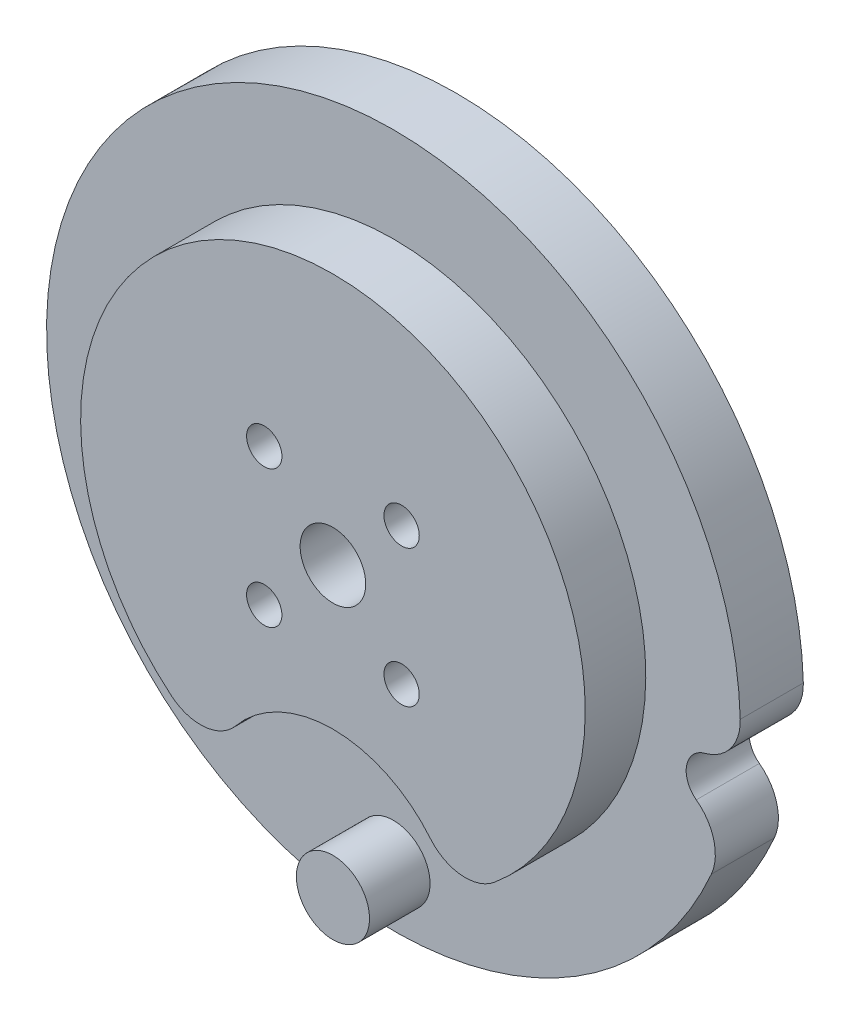
ISO-10303-21;
HEADER;
FILE_DESCRIPTION(('STEP AP214'),'2;1');
FILE_NAME('part.step','',(''),(''),'','','');
FILE_SCHEMA(('AUTOMOTIVE_DESIGN { 1 0 10303 214 1 1 1 1 }'));
ENDSEC;
DATA;
#1=APPLICATION_CONTEXT('core data for automotive mechanical design processes');
#2=APPLICATION_PROTOCOL_DEFINITION('international standard','automotive_design',2000,#1);
#3=PRODUCT_CONTEXT('',#1,'mechanical');
#4=PRODUCT('Part','Part','',(#3));
#5=PRODUCT_RELATED_PRODUCT_CATEGORY('part','',(#4));
#6=PRODUCT_DEFINITION_FORMATION('','',#4);
#7=PRODUCT_DEFINITION_CONTEXT('part definition',#1,'design');
#8=PRODUCT_DEFINITION('design','',#6,#7);
#9=PRODUCT_DEFINITION_SHAPE('','',#8);
#10=(LENGTH_UNIT() NAMED_UNIT(*) SI_UNIT(.MILLI.,.METRE.));
#11=(NAMED_UNIT(*) PLANE_ANGLE_UNIT() SI_UNIT($,.RADIAN.));
#12=(NAMED_UNIT(*) SI_UNIT($,.STERADIAN.) SOLID_ANGLE_UNIT());
#13=UNCERTAINTY_MEASURE_WITH_UNIT(LENGTH_MEASURE(1.E-05),#10,'distance_accuracy_value','');
#14=(GEOMETRIC_REPRESENTATION_CONTEXT(3) GLOBAL_UNCERTAINTY_ASSIGNED_CONTEXT((#13)) GLOBAL_UNIT_ASSIGNED_CONTEXT((#10,
#11,#12)) REPRESENTATION_CONTEXT('',''));
#15=CARTESIAN_POINT('',(0.,0.,0.));
#16=DIRECTION('',(0.,0.,1.));
#17=DIRECTION('',(1.,0.,0.));
#18=AXIS2_PLACEMENT_3D('',#15,#16,#17);
#19=CARTESIAN_POINT('',(0.,0.,6.35));
#20=DIRECTION('',(0.,0.,1.));
#21=DIRECTION('',(1.,0.,0.));
#22=AXIS2_PLACEMENT_3D('',#19,#20,#21);
#23=PLANE('',#22);
#24=CARTESIAN_POINT('',(0.,0.,6.35));
#25=DIRECTION('',(0.,0.,1.));
#26=DIRECTION('',(1.,0.,0.));
#27=AXIS2_PLACEMENT_3D('',#24,#25,#26);
#28=CIRCLE('',#27,34.925);
#29=CARTESIAN_POINT('',(34.9114398526221,0.97313535376458,6.35));
#30=VERTEX_POINT('',#29);
#31=CARTESIAN_POINT('',(32.0030522512435,-13.9842865961829,6.35));
#32=VERTEX_POINT('',#31);
#33=EDGE_CURVE('E158',#30,#32,#28,.T.);
#34=ORIENTED_EDGE('',*,*,#33,.T.);
#35=CARTESIAN_POINT('',(27.6389996715284,-12.0773384239761,6.35));
#36=DIRECTION('',(0.,0.,1.));
#37=DIRECTION('',(1.,0.,0.));
#38=AXIS2_PLACEMENT_3D('',#35,#36,#37);
#39=CIRCLE('',#38,4.7625);
#40=CARTESIAN_POINT('',(30.4857390161838,-8.25929162573083,6.35));
#41=VERTEX_POINT('',#40);
#42=EDGE_CURVE('E190',#32,#41,#39,.T.);
#43=ORIENTED_EDGE('',*,*,#42,.T.);
#44=CARTESIAN_POINT('',(32.004,-6.223,6.35));
#45=DIRECTION('',(0.,0.,1.));
#46=DIRECTION('',(1.,0.,0.));
#47=AXIS2_PLACEMENT_3D('',#44,#45,#46);
#48=CIRCLE('',#47,2.54);
#49=CARTESIAN_POINT('',(31.3594048569142,-3.76615301626044,6.35));
#50=VERTEX_POINT('',#49);
#51=EDGE_CURVE('E230',#50,#41,#48,.T.);
#52=ORIENTED_EDGE('',*,*,#51,.F.);
#53=CARTESIAN_POINT('',(30.1507889636282,0.840435078251228,6.35));
#54=DIRECTION('',(0.,0.,1.));
#55=DIRECTION('',(1.,0.,0.));
#56=AXIS2_PLACEMENT_3D('',#53,#54,#55);
#57=CIRCLE('',#56,4.7625);
#58=EDGE_CURVE('E187',#50,#30,#57,.T.);
#59=ORIENTED_EDGE('',*,*,#58,.T.);
#60=EDGE_LOOP('',(#34,#43,#52,#59));
#61=FACE_BOUND('',#60,.T.);
#62=CARTESIAN_POINT('',(0.,-28.971875,6.35));
#63=DIRECTION('',(0.,0.,1.));
#64=DIRECTION('',(1.,0.,0.));
#65=AXIS2_PLACEMENT_3D('',#62,#63,#64);
#66=CIRCLE('',#65,3.683);
#67=CARTESIAN_POINT('',(-3.683,-28.971875,6.35));
#68=VERTEX_POINT('',#67);
#69=EDGE_CURVE('E210',#68,#68,#66,.T.);
#70=ORIENTED_EDGE('',*,*,#69,.F.);
#71=EDGE_LOOP('',(#70));
#72=FACE_BOUND('',#71,.T.);
#73=CARTESIAN_POINT('',(0.,-26.9875,6.35));
#74=DIRECTION('',(0.,0.,-1.));
#75=DIRECTION('',(-1.,0.,0.));
#76=AXIS2_PLACEMENT_3D('',#73,#74,#75);
#77=CIRCLE('',#76,12.7);
#78=CARTESIAN_POINT('',(-9.80127488484027,-18.9112997404844,6.35));
#79=VERTEX_POINT('',#78);
#80=CARTESIAN_POINT('',(9.80127488484027,-18.9112997404844,6.35));
#81=VERTEX_POINT('',#80);
#82=EDGE_CURVE('E131',#79,#81,#77,.T.);
#83=ORIENTED_EDGE('',*,*,#82,.F.);
#84=CARTESIAN_POINT('',(-13.3297338433828,-16.0038676470588,6.35));
#85=DIRECTION('',(0.,0.,1.));
#86=DIRECTION('',(1.,0.,0.));
#87=AXIS2_PLACEMENT_3D('',#84,#85,#86);
#88=CIRCLE('',#87,4.572);
#89=CARTESIAN_POINT('',(-16.2557729797351,-19.5169117647059,6.35));
#90=VERTEX_POINT('',#89);
#91=EDGE_CURVE('E114',#79,#90,#88,.F.);
#92=ORIENTED_EDGE('',*,*,#91,.T.);
#93=CARTESIAN_POINT('',(0.,0.,6.35));
#94=DIRECTION('',(0.,0.,1.));
#95=DIRECTION('',(1.,0.,0.));
#96=AXIS2_PLACEMENT_3D('',#93,#94,#95);
#97=CIRCLE('',#96,25.4);
#98=CARTESIAN_POINT('',(16.2557729797351,-19.5169117647059,6.35));
#99=VERTEX_POINT('',#98);
#100=EDGE_CURVE('E121',#99,#90,#97,.T.);
#101=ORIENTED_EDGE('',*,*,#100,.F.);
#102=CARTESIAN_POINT('',(13.3297338433828,-16.0038676470588,6.35));
#103=DIRECTION('',(0.,0.,1.));
#104=DIRECTION('',(1.,0.,0.));
#105=AXIS2_PLACEMENT_3D('',#102,#103,#104);
#106=CIRCLE('',#105,4.572);
#107=EDGE_CURVE('E103',#99,#81,#106,.F.);
#108=ORIENTED_EDGE('',*,*,#107,.T.);
#109=EDGE_LOOP('',(#83,#92,#101,#108));
#110=FACE_BOUND('',#109,.T.);
#111=ADVANCED_FACE('F38',(#61,#72,#110),#23,.T.);
#112=CARTESIAN_POINT('',(0.,0.,0.));
#113=DIRECTION('',(0.,0.,1.));
#114=DIRECTION('',(1.,0.,0.));
#115=AXIS2_PLACEMENT_3D('',#112,#113,#114);
#116=PLANE('',#115);
#117=CARTESIAN_POINT('',(0.,0.,0.));
#118=DIRECTION('',(0.,0.,1.));
#119=DIRECTION('',(1.,0.,0.));
#120=AXIS2_PLACEMENT_3D('',#117,#118,#119);
#121=CIRCLE('',#120,3.302);
#122=CARTESIAN_POINT('',(3.302,0.,0.));
#123=VERTEX_POINT('',#122);
#124=EDGE_CURVE('E214',#123,#123,#121,.T.);
#125=ORIENTED_EDGE('',*,*,#124,.T.);
#126=EDGE_LOOP('',(#125));
#127=FACE_BOUND('',#126,.T.);
#128=CARTESIAN_POINT('',(32.004,-6.223,0.));
#129=DIRECTION('',(0.,0.,-1.));
#130=DIRECTION('',(-1.,0.,0.));
#131=AXIS2_PLACEMENT_3D('',#128,#129,#130);
#132=CIRCLE('',#131,2.54);
#133=CARTESIAN_POINT('',(30.4857390161838,-8.25929162573083,0.));
#134=VERTEX_POINT('',#133);
#135=CARTESIAN_POINT('',(31.3594048569142,-3.76615301626044,0.));
#136=VERTEX_POINT('',#135);
#137=EDGE_CURVE('E236',#134,#136,#132,.T.);
#138=ORIENTED_EDGE('',*,*,#137,.F.);
#139=CARTESIAN_POINT('',(27.6389996715284,-12.0773384239761,0.));
#140=DIRECTION('',(0.,0.,1.));
#141=DIRECTION('',(1.,0.,0.));
#142=AXIS2_PLACEMENT_3D('',#139,#140,#141);
#143=CIRCLE('',#142,4.7625);
#144=CARTESIAN_POINT('',(32.0030522512435,-13.9842865961829,0.));
#145=VERTEX_POINT('',#144);
#146=EDGE_CURVE('E11',#134,#145,#143,.F.);
#147=ORIENTED_EDGE('',*,*,#146,.T.);
#148=CARTESIAN_POINT('',(0.,0.,0.));
#149=DIRECTION('',(0.,0.,1.));
#150=DIRECTION('',(1.,0.,0.));
#151=AXIS2_PLACEMENT_3D('',#148,#149,#150);
#152=CIRCLE('',#151,34.925);
#153=CARTESIAN_POINT('',(34.9114398526221,0.97313535376458,0.));
#154=VERTEX_POINT('',#153);
#155=EDGE_CURVE('E157',#154,#145,#152,.T.);
#156=ORIENTED_EDGE('',*,*,#155,.F.);
#157=CARTESIAN_POINT('',(30.1507889636282,0.840435078251228,0.));
#158=DIRECTION('',(0.,0.,1.));
#159=DIRECTION('',(1.,0.,0.));
#160=AXIS2_PLACEMENT_3D('',#157,#158,#159);
#161=CIRCLE('',#160,4.7625);
#162=EDGE_CURVE('E47',#154,#136,#161,.F.);
#163=ORIENTED_EDGE('',*,*,#162,.T.);
#164=EDGE_LOOP('',(#138,#147,#156,#163));
#165=FACE_BOUND('',#164,.T.);
#166=CARTESIAN_POINT('',(6.91479721322325,6.91479721322325,0.));
#167=DIRECTION('',(0.,0.,1.));
#168=DIRECTION('',(1.,0.,0.));
#169=AXIS2_PLACEMENT_3D('',#166,#167,#168);
#170=CIRCLE('',#169,1.778);
#171=CARTESIAN_POINT('',(8.69279721322325,6.91479721322325,0.));
#172=VERTEX_POINT('',#171);
#173=EDGE_CURVE('E153',#172,#172,#170,.T.);
#174=ORIENTED_EDGE('',*,*,#173,.T.);
#175=EDGE_LOOP('',(#174));
#176=FACE_BOUND('',#175,.T.);
#177=CARTESIAN_POINT('',(-6.91479721322325,6.91479721322325,0.));
#178=DIRECTION('',(0.,0.,1.));
#179=DIRECTION('',(1.,0.,0.));
#180=AXIS2_PLACEMENT_3D('',#177,#178,#179);
#181=CIRCLE('',#180,1.778);
#182=CARTESIAN_POINT('',(-5.13679721322325,6.91479721322325,0.));
#183=VERTEX_POINT('',#182);
#184=EDGE_CURVE('E149',#183,#183,#181,.T.);
#185=ORIENTED_EDGE('',*,*,#184,.T.);
#186=EDGE_LOOP('',(#185));
#187=FACE_BOUND('',#186,.T.);
#188=CARTESIAN_POINT('',(6.91479721322325,-6.91479721322325,0.));
#189=DIRECTION('',(0.,0.,1.));
#190=DIRECTION('',(1.,0.,0.));
#191=AXIS2_PLACEMENT_3D('',#188,#189,#190);
#192=CIRCLE('',#191,1.778);
#193=CARTESIAN_POINT('',(8.69279721322325,-6.91479721322325,0.));
#194=VERTEX_POINT('',#193);
#195=EDGE_CURVE('E145',#194,#194,#192,.T.);
#196=ORIENTED_EDGE('',*,*,#195,.T.);
#197=EDGE_LOOP('',(#196));
#198=FACE_BOUND('',#197,.T.);
#199=CARTESIAN_POINT('',(-6.91479721322325,-6.91479721322325,0.));
#200=DIRECTION('',(0.,0.,1.));
#201=DIRECTION('',(1.,0.,0.));
#202=AXIS2_PLACEMENT_3D('',#199,#200,#201);
#203=CIRCLE('',#202,1.778);
#204=CARTESIAN_POINT('',(-5.13679721322325,-6.91479721322325,0.));
#205=VERTEX_POINT('',#204);
#206=EDGE_CURVE('E141',#205,#205,#203,.T.);
#207=ORIENTED_EDGE('',*,*,#206,.T.);
#208=EDGE_LOOP('',(#207));
#209=FACE_BOUND('',#208,.T.);
#210=ADVANCED_FACE('F253',(#127,#165,#176,#187,#198,#209),#116,.F.);
#211=CARTESIAN_POINT('',(0.,0.,6.35));
#212=DIRECTION('',(0.,0.,-1.));
#213=DIRECTION('',(-1.,0.,0.));
#214=AXIS2_PLACEMENT_3D('',#211,#212,#213);
#215=CYLINDRICAL_SURFACE('',#214,34.925);
#216=ORIENTED_EDGE('',*,*,#155,.T.);
#217=DIRECTION('',(0.,0.,-1.));
#218=VECTOR('',#217,1.);
#219=CARTESIAN_POINT('',(32.0030522512435,-13.9842865961829,6.35));
#220=LINE('',#219,#218);
#221=EDGE_CURVE('E183',#145,#32,#220,.F.);
#222=ORIENTED_EDGE('',*,*,#221,.T.);
#223=ORIENTED_EDGE('',*,*,#33,.F.);
#224=DIRECTION('',(0.,0.,-1.));
#225=VECTOR('',#224,1.);
#226=CARTESIAN_POINT('',(34.9114398526221,0.97313535376458,6.35));
#227=LINE('',#226,#225);
#228=EDGE_CURVE('E179',#30,#154,#227,.T.);
#229=ORIENTED_EDGE('',*,*,#228,.T.);
#230=EDGE_LOOP('',(#216,#222,#223,#229));
#231=FACE_BOUND('',#230,.T.);
#232=ADVANCED_FACE('F249',(#231),#215,.T.);
#233=CARTESIAN_POINT('',(6.91479721322325,6.91479721322325,6.35));
#234=DIRECTION('',(0.,0.,-1.));
#235=DIRECTION('',(-1.,0.,0.));
#236=AXIS2_PLACEMENT_3D('',#233,#234,#235);
#237=CYLINDRICAL_SURFACE('',#236,1.778);
#238=ORIENTED_EDGE('',*,*,#173,.F.);
#239=EDGE_LOOP('',(#238));
#240=FACE_BOUND('',#239,.T.);
#241=CARTESIAN_POINT('',(6.91479721322325,6.91479721322325,12.446));
#242=DIRECTION('',(0.,0.,1.));
#243=DIRECTION('',(1.,0.,0.));
#244=AXIS2_PLACEMENT_3D('',#241,#242,#243);
#245=CIRCLE('',#244,1.778);
#246=CARTESIAN_POINT('',(8.69279721322325,6.91479721322325,12.446));
#247=VERTEX_POINT('',#246);
#248=EDGE_CURVE('E205',#247,#247,#245,.T.);
#249=ORIENTED_EDGE('',*,*,#248,.T.);
#250=EDGE_LOOP('',(#249));
#251=FACE_BOUND('',#250,.T.);
#252=ADVANCED_FACE('F287',(#240,#251),#237,.F.);
#253=CARTESIAN_POINT('',(-6.91479721322325,6.91479721322325,6.35));
#254=DIRECTION('',(0.,0.,-1.));
#255=DIRECTION('',(-1.,0.,0.));
#256=AXIS2_PLACEMENT_3D('',#253,#254,#255);
#257=CYLINDRICAL_SURFACE('',#256,1.778);
#258=ORIENTED_EDGE('',*,*,#184,.F.);
#259=EDGE_LOOP('',(#258));
#260=FACE_BOUND('',#259,.T.);
#261=CARTESIAN_POINT('',(-6.91479721322325,6.91479721322325,12.446));
#262=DIRECTION('',(0.,0.,1.));
#263=DIRECTION('',(1.,0.,0.));
#264=AXIS2_PLACEMENT_3D('',#261,#262,#263);
#265=CIRCLE('',#264,1.778);
#266=CARTESIAN_POINT('',(-5.13679721322325,6.91479721322325,12.446));
#267=VERTEX_POINT('',#266);
#268=EDGE_CURVE('E137',#267,#267,#265,.T.);
#269=ORIENTED_EDGE('',*,*,#268,.T.);
#270=EDGE_LOOP('',(#269));
#271=FACE_BOUND('',#270,.T.);
#272=ADVANCED_FACE('F289',(#260,#271),#257,.F.);
#273=CARTESIAN_POINT('',(6.91479721322325,-6.91479721322325,6.35));
#274=DIRECTION('',(0.,0.,-1.));
#275=DIRECTION('',(-1.,0.,0.));
#276=AXIS2_PLACEMENT_3D('',#273,#274,#275);
#277=CYLINDRICAL_SURFACE('',#276,1.778);
#278=ORIENTED_EDGE('',*,*,#195,.F.);
#279=EDGE_LOOP('',(#278));
#280=FACE_BOUND('',#279,.T.);
#281=CARTESIAN_POINT('',(6.91479721322325,-6.91479721322325,12.446));
#282=DIRECTION('',(0.,0.,-1.));
#283=DIRECTION('',(-1.,0.,0.));
#284=AXIS2_PLACEMENT_3D('',#281,#282,#283);
#285=CIRCLE('',#284,1.778);
#286=CARTESIAN_POINT('',(5.13679721322325,-6.91479721322325,12.446));
#287=VERTEX_POINT('',#286);
#288=EDGE_CURVE('E222',#287,#287,#285,.T.);
#289=ORIENTED_EDGE('',*,*,#288,.F.);
#290=EDGE_LOOP('',(#289));
#291=FACE_BOUND('',#290,.T.);
#292=ADVANCED_FACE('F269',(#280,#291),#277,.F.);
#293=CARTESIAN_POINT('',(-6.91479721322325,-6.91479721322325,6.35));
#294=DIRECTION('',(0.,0.,-1.));
#295=DIRECTION('',(-1.,0.,0.));
#296=AXIS2_PLACEMENT_3D('',#293,#294,#295);
#297=CYLINDRICAL_SURFACE('',#296,1.778);
#298=ORIENTED_EDGE('',*,*,#206,.F.);
#299=EDGE_LOOP('',(#298));
#300=FACE_BOUND('',#299,.T.);
#301=CARTESIAN_POINT('',(-6.91479721322325,-6.91479721322325,12.446));
#302=DIRECTION('',(0.,0.,-1.));
#303=DIRECTION('',(-1.,0.,0.));
#304=AXIS2_PLACEMENT_3D('',#301,#302,#303);
#305=CIRCLE('',#304,1.778);
#306=CARTESIAN_POINT('',(-8.69279721322325,-6.91479721322325,12.446));
#307=VERTEX_POINT('',#306);
#308=EDGE_CURVE('E226',#307,#307,#305,.T.);
#309=ORIENTED_EDGE('',*,*,#308,.F.);
#310=EDGE_LOOP('',(#309));
#311=FACE_BOUND('',#310,.T.);
#312=ADVANCED_FACE('F266',(#300,#311),#297,.F.);
#313=CARTESIAN_POINT('',(0.,0.,12.446));
#314=DIRECTION('',(0.,0.,-1.));
#315=DIRECTION('',(-1.,0.,0.));
#316=AXIS2_PLACEMENT_3D('',#313,#314,#315);
#317=CYLINDRICAL_SURFACE('',#316,25.4);
#318=CARTESIAN_POINT('',(0.,0.,12.446));
#319=DIRECTION('',(0.,0.,1.));
#320=DIRECTION('',(1.,0.,0.));
#321=AXIS2_PLACEMENT_3D('',#318,#319,#320);
#322=CIRCLE('',#321,25.4);
#323=CARTESIAN_POINT('',(16.2557729797351,-19.5169117647059,12.446));
#324=VERTEX_POINT('',#323);
#325=CARTESIAN_POINT('',(-16.2557729797351,-19.5169117647059,12.446));
#326=VERTEX_POINT('',#325);
#327=EDGE_CURVE('E124',#324,#326,#322,.T.);
#328=ORIENTED_EDGE('',*,*,#327,.F.);
#329=DIRECTION('',(0.,0.,-1.));
#330=VECTOR('',#329,1.);
#331=CARTESIAN_POINT('',(16.2557729797351,-19.5169117647059,12.446));
#332=LINE('',#331,#330);
#333=EDGE_CURVE('E107',#324,#99,#332,.T.);
#334=ORIENTED_EDGE('',*,*,#333,.T.);
#335=ORIENTED_EDGE('',*,*,#100,.T.);
#336=DIRECTION('',(0.,0.,-1.));
#337=VECTOR('',#336,1.);
#338=CARTESIAN_POINT('',(-16.2557729797351,-19.5169117647059,12.446));
#339=LINE('',#338,#337);
#340=EDGE_CURVE('E127',#90,#326,#339,.F.);
#341=ORIENTED_EDGE('',*,*,#340,.T.);
#342=EDGE_LOOP('',(#328,#334,#335,#341));
#343=FACE_BOUND('',#342,.T.);
#344=ADVANCED_FACE('F120',(#343),#317,.T.);
#345=CARTESIAN_POINT('',(0.,-26.9875,12.446));
#346=DIRECTION('',(0.,0.,-1.));
#347=DIRECTION('',(-1.,0.,0.));
#348=AXIS2_PLACEMENT_3D('',#345,#346,#347);
#349=CYLINDRICAL_SURFACE('',#348,12.7);
#350=ORIENTED_EDGE('',*,*,#82,.T.);
#351=DIRECTION('',(0.,0.,-1.));
#352=VECTOR('',#351,1.);
#353=CARTESIAN_POINT('',(9.80127488484027,-18.9112997404844,12.446));
#354=LINE('',#353,#352);
#355=CARTESIAN_POINT('',(9.80127488484027,-18.9112997404844,12.446));
#356=VERTEX_POINT('',#355);
#357=EDGE_CURVE('E108',#81,#356,#354,.F.);
#358=ORIENTED_EDGE('',*,*,#357,.T.);
#359=CARTESIAN_POINT('',(0.,-26.9875,12.446));
#360=DIRECTION('',(0.,0.,-1.));
#361=DIRECTION('',(-1.,0.,0.));
#362=AXIS2_PLACEMENT_3D('',#359,#360,#361);
#363=CIRCLE('',#362,12.7);
#364=CARTESIAN_POINT('',(-9.80127488484027,-18.9112997404844,12.446));
#365=VERTEX_POINT('',#364);
#366=EDGE_CURVE('E130',#365,#356,#363,.T.);
#367=ORIENTED_EDGE('',*,*,#366,.F.);
#368=DIRECTION('',(0.,0.,-1.));
#369=VECTOR('',#368,1.);
#370=CARTESIAN_POINT('',(-9.80127488484027,-18.9112997404844,12.446));
#371=LINE('',#370,#369);
#372=EDGE_CURVE('E126',#365,#79,#371,.T.);
#373=ORIENTED_EDGE('',*,*,#372,.T.);
#374=EDGE_LOOP('',(#350,#358,#367,#373));
#375=FACE_BOUND('',#374,.T.);
#376=ADVANCED_FACE('F277',(#375),#349,.F.);
#377=CARTESIAN_POINT('',(0.,-13.49375,12.446));
#378=DIRECTION('',(0.,0.,-1.));
#379=DIRECTION('',(-1.,0.,0.));
#380=AXIS2_PLACEMENT_3D('',#377,#378,#379);
#381=PLANE('',#380);
#382=ORIENTED_EDGE('',*,*,#288,.T.);
#383=EDGE_LOOP('',(#382));
#384=FACE_BOUND('',#383,.T.);
#385=ORIENTED_EDGE('',*,*,#308,.T.);
#386=EDGE_LOOP('',(#385));
#387=FACE_BOUND('',#386,.T.);
#388=CARTESIAN_POINT('',(0.,0.,12.446));
#389=DIRECTION('',(0.,0.,1.));
#390=DIRECTION('',(1.,0.,0.));
#391=AXIS2_PLACEMENT_3D('',#388,#389,#390);
#392=CIRCLE('',#391,3.302);
#393=CARTESIAN_POINT('',(3.302,0.,12.446));
#394=VERTEX_POINT('',#393);
#395=EDGE_CURVE('E218',#394,#394,#392,.T.);
#396=ORIENTED_EDGE('',*,*,#395,.F.);
#397=EDGE_LOOP('',(#396));
#398=FACE_BOUND('',#397,.T.);
#399=ORIENTED_EDGE('',*,*,#366,.T.);
#400=CARTESIAN_POINT('',(13.3297338433828,-16.0038676470588,12.446));
#401=DIRECTION('',(0.,0.,-1.));
#402=DIRECTION('',(-1.,0.,0.));
#403=AXIS2_PLACEMENT_3D('',#400,#401,#402);
#404=CIRCLE('',#403,4.572);
#405=EDGE_CURVE('E115',#356,#324,#404,.F.);
#406=ORIENTED_EDGE('',*,*,#405,.T.);
#407=ORIENTED_EDGE('',*,*,#327,.T.);
#408=CARTESIAN_POINT('',(-13.3297338433828,-16.0038676470588,12.446));
#409=DIRECTION('',(0.,0.,-1.));
#410=DIRECTION('',(-1.,0.,0.));
#411=AXIS2_PLACEMENT_3D('',#408,#409,#410);
#412=CIRCLE('',#411,4.572);
#413=EDGE_CURVE('E172',#326,#365,#412,.F.);
#414=ORIENTED_EDGE('',*,*,#413,.T.);
#415=EDGE_LOOP('',(#399,#406,#407,#414));
#416=FACE_BOUND('',#415,.T.);
#417=ORIENTED_EDGE('',*,*,#268,.F.);
#418=EDGE_LOOP('',(#417));
#419=FACE_BOUND('',#418,.T.);
#420=ORIENTED_EDGE('',*,*,#248,.F.);
#421=EDGE_LOOP('',(#420));
#422=FACE_BOUND('',#421,.T.);
#423=ADVANCED_FACE('F273',(#384,#387,#398,#416,#419,#422),#381,.F.);
#424=CARTESIAN_POINT('',(0.,-28.971875,12.446));
#425=DIRECTION('',(0.,0.,-1.));
#426=DIRECTION('',(-1.,0.,0.));
#427=AXIS2_PLACEMENT_3D('',#424,#425,#426);
#428=CYLINDRICAL_SURFACE('',#427,3.683);
#429=CARTESIAN_POINT('',(0.,-28.971875,12.446));
#430=DIRECTION('',(0.,0.,1.));
#431=DIRECTION('',(1.,0.,0.));
#432=AXIS2_PLACEMENT_3D('',#429,#430,#431);
#433=CIRCLE('',#432,3.683);
#434=CARTESIAN_POINT('',(-3.683,-28.971875,12.446));
#435=VERTEX_POINT('',#434);
#436=EDGE_CURVE('E209',#435,#435,#433,.T.);
#437=CARTESIAN_POINT('',(-3.683,-28.971875,12.446));
#438=CARTESIAN_POINT('',(-3.683,-28.971875,12.3825));
#439=CARTESIAN_POINT('',(-3.683,-28.971875,12.319));
#440=CARTESIAN_POINT('',(-3.683,-28.971875,12.192));
#441=CARTESIAN_POINT('',(-3.683,-28.971875,12.1285));
#442=CARTESIAN_POINT('',(-3.683,-28.971875,12.0015));
#443=CARTESIAN_POINT('',(-3.683,-28.971875,11.938));
#444=CARTESIAN_POINT('',(-3.683,-28.971875,11.811));
#445=CARTESIAN_POINT('',(-3.683,-28.971875,11.7475));
#446=CARTESIAN_POINT('',(-3.683,-28.971875,11.6205));
#447=CARTESIAN_POINT('',(-3.683,-28.971875,11.557));
#448=CARTESIAN_POINT('',(-3.683,-28.971875,11.43));
#449=CARTESIAN_POINT('',(-3.683,-28.971875,11.3665));
#450=CARTESIAN_POINT('',(-3.683,-28.971875,11.2395));
#451=CARTESIAN_POINT('',(-3.683,-28.971875,11.176));
#452=CARTESIAN_POINT('',(-3.683,-28.971875,11.049));
#453=CARTESIAN_POINT('',(-3.683,-28.971875,10.9855));
#454=CARTESIAN_POINT('',(-3.683,-28.971875,10.8585));
#455=CARTESIAN_POINT('',(-3.683,-28.971875,10.795));
#456=CARTESIAN_POINT('',(-3.683,-28.971875,10.668));
#457=CARTESIAN_POINT('',(-3.683,-28.971875,10.6045));
#458=CARTESIAN_POINT('',(-3.683,-28.971875,10.4775));
#459=CARTESIAN_POINT('',(-3.683,-28.971875,10.414));
#460=CARTESIAN_POINT('',(-3.683,-28.971875,10.287));
#461=CARTESIAN_POINT('',(-3.683,-28.971875,10.2235));
#462=CARTESIAN_POINT('',(-3.683,-28.971875,10.0965));
#463=CARTESIAN_POINT('',(-3.683,-28.971875,10.033));
#464=CARTESIAN_POINT('',(-3.683,-28.971875,9.906));
#465=CARTESIAN_POINT('',(-3.683,-28.971875,9.8425));
#466=CARTESIAN_POINT('',(-3.683,-28.971875,9.7155));
#467=CARTESIAN_POINT('',(-3.683,-28.971875,9.652));
#468=CARTESIAN_POINT('',(-3.683,-28.971875,9.525));
#469=CARTESIAN_POINT('',(-3.683,-28.971875,9.4615));
#470=CARTESIAN_POINT('',(-3.683,-28.971875,9.3345));
#471=CARTESIAN_POINT('',(-3.683,-28.971875,9.271));
#472=CARTESIAN_POINT('',(-3.683,-28.971875,9.144));
#473=CARTESIAN_POINT('',(-3.683,-28.971875,9.0805));
#474=CARTESIAN_POINT('',(-3.683,-28.971875,8.9535));
#475=CARTESIAN_POINT('',(-3.683,-28.971875,8.89));
#476=CARTESIAN_POINT('',(-3.683,-28.971875,8.763));
#477=CARTESIAN_POINT('',(-3.683,-28.971875,8.6995));
#478=CARTESIAN_POINT('',(-3.683,-28.971875,8.5725));
#479=CARTESIAN_POINT('',(-3.683,-28.971875,8.509));
#480=CARTESIAN_POINT('',(-3.683,-28.971875,8.382));
#481=CARTESIAN_POINT('',(-3.683,-28.971875,8.3185));
#482=CARTESIAN_POINT('',(-3.683,-28.971875,8.1915));
#483=CARTESIAN_POINT('',(-3.683,-28.971875,8.128));
#484=CARTESIAN_POINT('',(-3.683,-28.971875,8.001));
#485=CARTESIAN_POINT('',(-3.683,-28.971875,7.9375));
#486=CARTESIAN_POINT('',(-3.683,-28.971875,7.8105));
#487=CARTESIAN_POINT('',(-3.683,-28.971875,7.747));
#488=CARTESIAN_POINT('',(-3.683,-28.971875,7.62));
#489=CARTESIAN_POINT('',(-3.683,-28.971875,7.5565));
#490=CARTESIAN_POINT('',(-3.683,-28.971875,7.4295));
#491=CARTESIAN_POINT('',(-3.683,-28.971875,7.366));
#492=CARTESIAN_POINT('',(-3.683,-28.971875,7.239));
#493=CARTESIAN_POINT('',(-3.683,-28.971875,7.1755));
#494=CARTESIAN_POINT('',(-3.683,-28.971875,7.0485));
#495=CARTESIAN_POINT('',(-3.683,-28.971875,6.985));
#496=CARTESIAN_POINT('',(-3.683,-28.971875,6.858));
#497=CARTESIAN_POINT('',(-3.683,-28.971875,6.7945));
#498=CARTESIAN_POINT('',(-3.683,-28.971875,6.6675));
#499=CARTESIAN_POINT('',(-3.683,-28.971875,6.604));
#500=CARTESIAN_POINT('',(-3.683,-28.971875,6.477));
#501=CARTESIAN_POINT('',(-3.683,-28.971875,6.4135));
#502=CARTESIAN_POINT('',(-3.683,-28.971875,6.35));
#503=B_SPLINE_CURVE_WITH_KNOTS('',3,(#437,#438,#439,#440,#441,#442,#443,#444,#445,#446,#447,
#448,#449,#450,#451,#452,#453,#454,#455,#456,#457,#458,#459,#460,#461,#462,#463,#464,#465,#466,
#467,#468,#469,#470,#471,#472,#473,#474,#475,#476,#477,#478,#479,#480,#481,#482,#483,#484,#485,
#486,#487,#488,#489,#490,#491,#492,#493,#494,#495,#496,#497,#498,#499,#500,#501,#502),
.UNSPECIFIED.,.F.,.F.,(4,2,2,2,2,2,2,2,2,2,2,2,2,2,2,2,2,2,2,2,2,2,2,2,2,2,2,2,2,2,2,2,4),(0.,
0.190500000000001,0.381000000000001,0.571500000000001,0.762000000000001,0.9525,1.143,1.3335,
1.524,1.7145,1.905,2.0955,2.286,2.4765,2.667,2.8575,3.048,3.2385,3.429,3.6195,3.81,4.0005,4.191,
4.3815,4.572,4.7625,4.953,5.1435,5.334,5.5245,5.715,5.9055,6.096),.UNSPECIFIED.);
#504=EDGE_CURVE('BSEAM276',#435,#68,#503,.T.);
#505=ORIENTED_EDGE('',*,*,#436,.F.);
#506=ORIENTED_EDGE('',*,*,#69,.T.);
#507=ORIENTED_EDGE('',*,*,#504,.T.);
#508=ORIENTED_EDGE('',*,*,#504,.F.);
#509=EDGE_LOOP('',(#505,#507,#506,#508));
#510=FACE_BOUND('',#509,.T.);
#511=ADVANCED_FACE('F276',(#510),#428,.T.);
#512=CARTESIAN_POINT('',(0.,-28.971875,12.446));
#513=DIRECTION('',(0.,0.,1.));
#514=DIRECTION('',(1.,0.,0.));
#515=AXIS2_PLACEMENT_3D('',#512,#513,#514);
#516=PLANE('',#515);
#517=ORIENTED_EDGE('',*,*,#436,.T.);
#518=EDGE_LOOP('',(#517));
#519=FACE_BOUND('',#518,.T.);
#520=ADVANCED_FACE('F323',(#519),#516,.T.);
#521=CARTESIAN_POINT('',(0.,0.,0.));
#522=DIRECTION('',(0.,0.,1.));
#523=DIRECTION('',(1.,0.,0.));
#524=AXIS2_PLACEMENT_3D('',#521,#522,#523);
#525=CYLINDRICAL_SURFACE('',#524,3.302);
#526=ORIENTED_EDGE('',*,*,#124,.F.);
#527=EDGE_LOOP('',(#526));
#528=FACE_BOUND('',#527,.T.);
#529=ORIENTED_EDGE('',*,*,#395,.T.);
#530=EDGE_LOOP('',(#529));
#531=FACE_BOUND('',#530,.T.);
#532=ADVANCED_FACE('F309',(#528,#531),#525,.F.);
#533=CARTESIAN_POINT('',(13.3297338433828,-16.0038676470588,12.446));
#534=DIRECTION('',(0.,0.,1.));
#535=DIRECTION('',(1.,0.,0.));
#536=AXIS2_PLACEMENT_3D('',#533,#534,#535);
#537=CYLINDRICAL_SURFACE('',#536,4.572);
#538=ORIENTED_EDGE('',*,*,#405,.F.);
#539=ORIENTED_EDGE('',*,*,#357,.F.);
#540=ORIENTED_EDGE('',*,*,#107,.F.);
#541=ORIENTED_EDGE('',*,*,#333,.F.);
#542=EDGE_LOOP('',(#538,#539,#540,#541));
#543=FACE_BOUND('',#542,.T.);
#544=ADVANCED_FACE('F106',(#543),#537,.T.);
#545=CARTESIAN_POINT('',(-13.3297338433828,-16.0038676470588,12.446));
#546=DIRECTION('',(0.,0.,1.));
#547=DIRECTION('',(1.,0.,0.));
#548=AXIS2_PLACEMENT_3D('',#545,#546,#547);
#549=CYLINDRICAL_SURFACE('',#548,4.572);
#550=ORIENTED_EDGE('',*,*,#413,.F.);
#551=ORIENTED_EDGE('',*,*,#340,.F.);
#552=ORIENTED_EDGE('',*,*,#91,.F.);
#553=ORIENTED_EDGE('',*,*,#372,.F.);
#554=EDGE_LOOP('',(#550,#551,#552,#553));
#555=FACE_BOUND('',#554,.T.);
#556=ADVANCED_FACE('F308',(#555),#549,.T.);
#557=CARTESIAN_POINT('',(32.004,-6.223,12.446));
#558=DIRECTION('',(0.,0.,-1.));
#559=DIRECTION('',(-1.,0.,0.));
#560=AXIS2_PLACEMENT_3D('',#557,#558,#559);
#561=CYLINDRICAL_SURFACE('',#560,2.54);
#562=ORIENTED_EDGE('',*,*,#51,.T.);
#563=DIRECTION('',(0.,0.,-1.));
#564=VECTOR('',#563,1.);
#565=CARTESIAN_POINT('',(30.4857390161838,-8.25929162573083,12.446));
#566=LINE('',#565,#564);
#567=EDGE_CURVE('E60',#41,#134,#566,.T.);
#568=ORIENTED_EDGE('',*,*,#567,.T.);
#569=ORIENTED_EDGE('',*,*,#137,.T.);
#570=DIRECTION('',(0.,0.,-1.));
#571=VECTOR('',#570,1.);
#572=CARTESIAN_POINT('',(31.3594048569142,-3.76615301626044,12.446));
#573=LINE('',#572,#571);
#574=EDGE_CURVE('E193',#136,#50,#573,.F.);
#575=ORIENTED_EDGE('',*,*,#574,.T.);
#576=EDGE_LOOP('',(#562,#568,#569,#575));
#577=FACE_BOUND('',#576,.T.);
#578=ADVANCED_FACE('F239',(#577),#561,.F.);
#579=CARTESIAN_POINT('',(27.6389996715284,-12.0773384239761,12.446));
#580=DIRECTION('',(0.,0.,-1.));
#581=DIRECTION('',(-1.,0.,0.));
#582=AXIS2_PLACEMENT_3D('',#579,#580,#581);
#583=CYLINDRICAL_SURFACE('',#582,4.7625);
#584=ORIENTED_EDGE('',*,*,#146,.F.);
#585=ORIENTED_EDGE('',*,*,#567,.F.);
#586=ORIENTED_EDGE('',*,*,#42,.F.);
#587=ORIENTED_EDGE('',*,*,#221,.F.);
#588=EDGE_LOOP('',(#584,#585,#586,#587));
#589=FACE_BOUND('',#588,.T.);
#590=ADVANCED_FACE('F252',(#589),#583,.T.);
#591=CARTESIAN_POINT('',(30.1507889636282,0.840435078251228,12.446));
#592=DIRECTION('',(0.,0.,1.));
#593=DIRECTION('',(1.,0.,0.));
#594=AXIS2_PLACEMENT_3D('',#591,#592,#593);
#595=CYLINDRICAL_SURFACE('',#594,4.7625);
#596=ORIENTED_EDGE('',*,*,#58,.F.);
#597=ORIENTED_EDGE('',*,*,#574,.F.);
#598=ORIENTED_EDGE('',*,*,#162,.F.);
#599=ORIENTED_EDGE('',*,*,#228,.F.);
#600=EDGE_LOOP('',(#596,#597,#598,#599));
#601=FACE_BOUND('',#600,.T.);
#602=ADVANCED_FACE('F40',(#601),#595,.T.);
#603=CLOSED_SHELL('',(#111,#210,#232,#252,#272,#292,#312,#344,#376,#423,#511,#520,#532,#544,
#556,#578,#590,#602));
#604=MANIFOLD_SOLID_BREP('B2',#603);
#605=ADVANCED_BREP_SHAPE_REPRESENTATION('',(#18,#604),#14);
#606=SHAPE_DEFINITION_REPRESENTATION(#9,#605);
ENDSEC;
END-ISO-10303-21;
